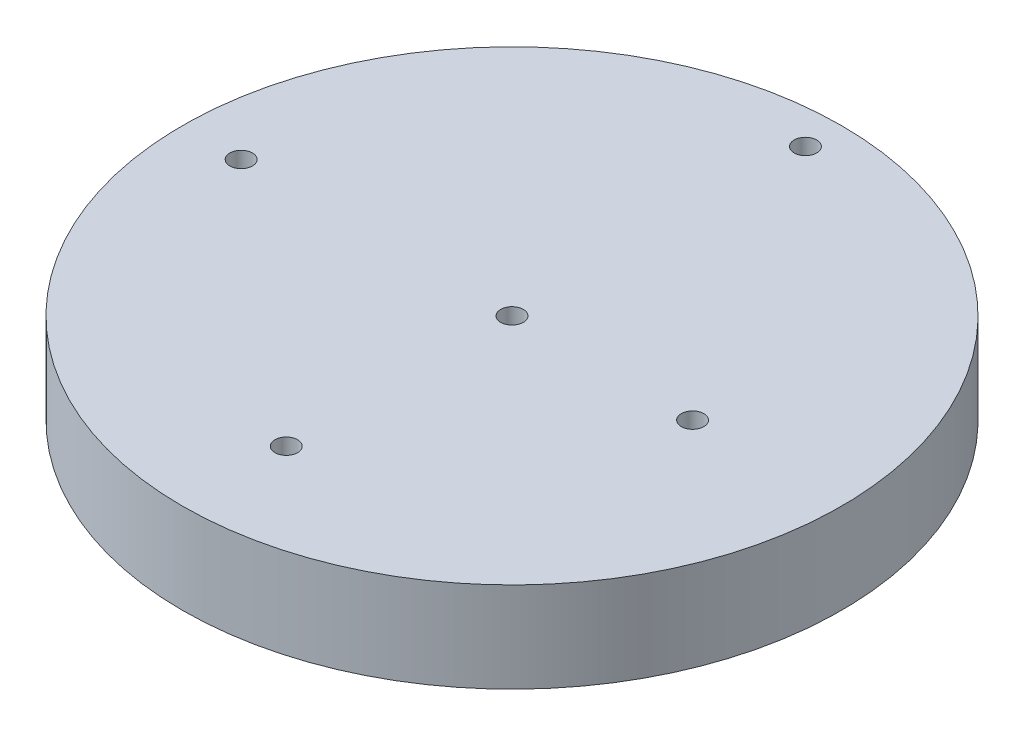
ISO-10303-21;
HEADER;
FILE_DESCRIPTION(('STEP AP214'),'2;1');
FILE_NAME('part.step','',(''),(''),'','','');
FILE_SCHEMA(('AUTOMOTIVE_DESIGN { 1 0 10303 214 1 1 1 1 }'));
ENDSEC;
DATA;
#1=APPLICATION_CONTEXT('core data for automotive mechanical design processes');
#2=APPLICATION_PROTOCOL_DEFINITION('international standard','automotive_design',2000,#1);
#3=PRODUCT_CONTEXT('',#1,'mechanical');
#4=PRODUCT('Part','Part','',(#3));
#5=PRODUCT_RELATED_PRODUCT_CATEGORY('part','',(#4));
#6=PRODUCT_DEFINITION_FORMATION('','',#4);
#7=PRODUCT_DEFINITION_CONTEXT('part definition',#1,'design');
#8=PRODUCT_DEFINITION('design','',#6,#7);
#9=PRODUCT_DEFINITION_SHAPE('','',#8);
#10=(LENGTH_UNIT() NAMED_UNIT(*) SI_UNIT(.MILLI.,.METRE.));
#11=(NAMED_UNIT(*) PLANE_ANGLE_UNIT() SI_UNIT($,.RADIAN.));
#12=(NAMED_UNIT(*) SI_UNIT($,.STERADIAN.) SOLID_ANGLE_UNIT());
#13=UNCERTAINTY_MEASURE_WITH_UNIT(LENGTH_MEASURE(1.E-05),#10,'distance_accuracy_value','');
#14=(GEOMETRIC_REPRESENTATION_CONTEXT(3) GLOBAL_UNCERTAINTY_ASSIGNED_CONTEXT((#13)) GLOBAL_UNIT_ASSIGNED_CONTEXT((#10,
#11,#12)) REPRESENTATION_CONTEXT('',''));
#15=CARTESIAN_POINT('',(0.,0.,0.));
#16=DIRECTION('',(0.,0.,1.));
#17=DIRECTION('',(1.,0.,0.));
#18=AXIS2_PLACEMENT_3D('',#15,#16,#17);
#19=CARTESIAN_POINT('',(0.,12.7,0.));
#20=DIRECTION('',(0.,1.,0.));
#21=DIRECTION('',(0.,0.,1.));
#22=AXIS2_PLACEMENT_3D('',#19,#20,#21);
#23=PLANE('',#22);
#24=CARTESIAN_POINT('',(-38.1,12.7,0.));
#25=DIRECTION('',(0.,1.,0.));
#26=DIRECTION('',(0.,0.,1.));
#27=AXIS2_PLACEMENT_3D('',#24,#25,#26);
#28=CIRCLE('',#27,1.5875);
#29=CARTESIAN_POINT('',(-38.1,12.7,1.5875));
#30=VERTEX_POINT('',#29);
#31=EDGE_CURVE('E59',#30,#30,#28,.T.);
#32=ORIENTED_EDGE('',*,*,#31,.F.);
#33=EDGE_LOOP('',(#32));
#34=FACE_BOUND('',#33,.T.);
#35=CARTESIAN_POINT('',(0.,12.7,-41.275));
#36=DIRECTION('',(0.,1.,0.));
#37=DIRECTION('',(0.,0.,1.));
#38=AXIS2_PLACEMENT_3D('',#35,#36,#37);
#39=CIRCLE('',#38,1.5875);
#40=CARTESIAN_POINT('',(0.,12.7,-39.6875));
#41=VERTEX_POINT('',#40);
#42=EDGE_CURVE('E47',#41,#41,#39,.T.);
#43=ORIENTED_EDGE('',*,*,#42,.F.);
#44=EDGE_LOOP('',(#43));
#45=FACE_BOUND('',#44,.T.);
#46=CARTESIAN_POINT('',(0.,12.7,0.));
#47=DIRECTION('',(0.,1.,0.));
#48=DIRECTION('',(0.,0.,1.));
#49=AXIS2_PLACEMENT_3D('',#46,#47,#48);
#50=CIRCLE('',#49,46.355);
#51=CARTESIAN_POINT('',(0.,12.7,46.355));
#52=VERTEX_POINT('',#51);
#53=EDGE_CURVE('E10',#52,#52,#50,.T.);
#54=ORIENTED_EDGE('',*,*,#53,.T.);
#55=EDGE_LOOP('',(#54));
#56=FACE_BOUND('',#55,.T.);
#57=CARTESIAN_POINT('',(0.,12.7,0.));
#58=DIRECTION('',(0.,1.,0.));
#59=DIRECTION('',(0.,0.,1.));
#60=AXIS2_PLACEMENT_3D('',#57,#58,#59);
#61=CIRCLE('',#60,1.5875);
#62=CARTESIAN_POINT('',(0.,12.7,1.5875));
#63=VERTEX_POINT('',#62);
#64=EDGE_CURVE('E42',#63,#63,#61,.T.);
#65=ORIENTED_EDGE('',*,*,#64,.F.);
#66=EDGE_LOOP('',(#65));
#67=FACE_BOUND('',#66,.T.);
#68=CARTESIAN_POINT('',(25.4,12.7,0.));
#69=DIRECTION('',(0.,1.,0.));
#70=DIRECTION('',(0.,0.,1.));
#71=AXIS2_PLACEMENT_3D('',#68,#69,#70);
#72=CIRCLE('',#71,1.5875);
#73=CARTESIAN_POINT('',(25.4,12.7,1.5875));
#74=VERTEX_POINT('',#73);
#75=EDGE_CURVE('E53',#74,#74,#72,.T.);
#76=ORIENTED_EDGE('',*,*,#75,.F.);
#77=EDGE_LOOP('',(#76));
#78=FACE_BOUND('',#77,.T.);
#79=CARTESIAN_POINT('',(0.,12.7,31.75));
#80=DIRECTION('',(0.,1.,0.));
#81=DIRECTION('',(0.,0.,1.));
#82=AXIS2_PLACEMENT_3D('',#79,#80,#81);
#83=CIRCLE('',#82,1.5875);
#84=CARTESIAN_POINT('',(0.,12.7,33.3375));
#85=VERTEX_POINT('',#84);
#86=EDGE_CURVE('E65',#85,#85,#83,.T.);
#87=ORIENTED_EDGE('',*,*,#86,.F.);
#88=EDGE_LOOP('',(#87));
#89=FACE_BOUND('',#88,.T.);
#90=ADVANCED_FACE('F31',(#34,#45,#56,#67,#78,#89),#23,.T.);
#91=CARTESIAN_POINT('',(0.,0.,0.));
#92=DIRECTION('',(0.,1.,0.));
#93=DIRECTION('',(0.,0.,1.));
#94=AXIS2_PLACEMENT_3D('',#91,#92,#93);
#95=PLANE('',#94);
#96=CARTESIAN_POINT('',(0.,0.,0.));
#97=DIRECTION('',(0.,1.,0.));
#98=DIRECTION('',(0.,0.,1.));
#99=AXIS2_PLACEMENT_3D('',#96,#97,#98);
#100=CIRCLE('',#99,46.355);
#101=CARTESIAN_POINT('',(0.,0.,46.355));
#102=VERTEX_POINT('',#101);
#103=EDGE_CURVE('E35',#102,#102,#100,.T.);
#104=ORIENTED_EDGE('',*,*,#103,.F.);
#105=EDGE_LOOP('',(#104));
#106=FACE_BOUND('',#105,.T.);
#107=CARTESIAN_POINT('',(0.,0.,0.));
#108=DIRECTION('',(0.,1.,0.));
#109=DIRECTION('',(0.,0.,1.));
#110=AXIS2_PLACEMENT_3D('',#107,#108,#109);
#111=CIRCLE('',#110,1.5875);
#112=CARTESIAN_POINT('',(0.,0.,1.5875));
#113=VERTEX_POINT('',#112);
#114=EDGE_CURVE('E44',#113,#113,#111,.T.);
#115=ORIENTED_EDGE('',*,*,#114,.T.);
#116=EDGE_LOOP('',(#115));
#117=FACE_BOUND('',#116,.T.);
#118=CARTESIAN_POINT('',(0.,0.,-41.275));
#119=DIRECTION('',(0.,1.,0.));
#120=DIRECTION('',(0.,0.,1.));
#121=AXIS2_PLACEMENT_3D('',#118,#119,#120);
#122=CIRCLE('',#121,1.5875);
#123=CARTESIAN_POINT('',(0.,0.,-39.6875));
#124=VERTEX_POINT('',#123);
#125=EDGE_CURVE('E50',#124,#124,#122,.T.);
#126=ORIENTED_EDGE('',*,*,#125,.T.);
#127=EDGE_LOOP('',(#126));
#128=FACE_BOUND('',#127,.T.);
#129=CARTESIAN_POINT('',(25.4,0.,0.));
#130=DIRECTION('',(0.,1.,0.));
#131=DIRECTION('',(0.,0.,1.));
#132=AXIS2_PLACEMENT_3D('',#129,#130,#131);
#133=CIRCLE('',#132,1.5875);
#134=CARTESIAN_POINT('',(25.4,0.,1.5875));
#135=VERTEX_POINT('',#134);
#136=EDGE_CURVE('E56',#135,#135,#133,.T.);
#137=ORIENTED_EDGE('',*,*,#136,.T.);
#138=EDGE_LOOP('',(#137));
#139=FACE_BOUND('',#138,.T.);
#140=CARTESIAN_POINT('',(-38.1,0.,0.));
#141=DIRECTION('',(0.,1.,0.));
#142=DIRECTION('',(0.,0.,1.));
#143=AXIS2_PLACEMENT_3D('',#140,#141,#142);
#144=CIRCLE('',#143,1.5875);
#145=CARTESIAN_POINT('',(-38.1,0.,1.5875));
#146=VERTEX_POINT('',#145);
#147=EDGE_CURVE('E62',#146,#146,#144,.T.);
#148=ORIENTED_EDGE('',*,*,#147,.T.);
#149=EDGE_LOOP('',(#148));
#150=FACE_BOUND('',#149,.T.);
#151=CARTESIAN_POINT('',(0.,0.,31.75));
#152=DIRECTION('',(0.,1.,0.));
#153=DIRECTION('',(0.,0.,1.));
#154=AXIS2_PLACEMENT_3D('',#151,#152,#153);
#155=CIRCLE('',#154,1.5875);
#156=CARTESIAN_POINT('',(0.,0.,33.3375));
#157=VERTEX_POINT('',#156);
#158=EDGE_CURVE('E68',#157,#157,#155,.T.);
#159=ORIENTED_EDGE('',*,*,#158,.T.);
#160=EDGE_LOOP('',(#159));
#161=FACE_BOUND('',#160,.T.);
#162=ADVANCED_FACE('F78',(#106,#117,#128,#139,#150,#161),#95,.F.);
#163=CARTESIAN_POINT('',(0.,12.7,0.));
#164=DIRECTION('',(0.,-1.,0.));
#165=DIRECTION('',(0.,0.,-1.));
#166=AXIS2_PLACEMENT_3D('',#163,#164,#165);
#167=CYLINDRICAL_SURFACE('',#166,46.355);
#168=ORIENTED_EDGE('',*,*,#53,.F.);
#169=EDGE_LOOP('',(#168));
#170=FACE_BOUND('',#169,.T.);
#171=ORIENTED_EDGE('',*,*,#103,.T.);
#172=EDGE_LOOP('',(#171));
#173=FACE_BOUND('',#172,.T.);
#174=ADVANCED_FACE('F33',(#170,#173),#167,.T.);
#175=CARTESIAN_POINT('',(0.,12.7,0.));
#176=DIRECTION('',(0.,-1.,0.));
#177=DIRECTION('',(0.,0.,-1.));
#178=AXIS2_PLACEMENT_3D('',#175,#176,#177);
#179=CYLINDRICAL_SURFACE('',#178,1.5875);
#180=ORIENTED_EDGE('',*,*,#64,.T.);
#181=EDGE_LOOP('',(#180));
#182=FACE_BOUND('',#181,.T.);
#183=ORIENTED_EDGE('',*,*,#114,.F.);
#184=EDGE_LOOP('',(#183));
#185=FACE_BOUND('',#184,.T.);
#186=ADVANCED_FACE('F88',(#182,#185),#179,.F.);
#187=CARTESIAN_POINT('',(0.,12.7,-41.275));
#188=DIRECTION('',(0.,-1.,0.));
#189=DIRECTION('',(0.,0.,-1.));
#190=AXIS2_PLACEMENT_3D('',#187,#188,#189);
#191=CYLINDRICAL_SURFACE('',#190,1.5875);
#192=ORIENTED_EDGE('',*,*,#42,.T.);
#193=EDGE_LOOP('',(#192));
#194=FACE_BOUND('',#193,.T.);
#195=ORIENTED_EDGE('',*,*,#125,.F.);
#196=EDGE_LOOP('',(#195));
#197=FACE_BOUND('',#196,.T.);
#198=ADVANCED_FACE('F91',(#194,#197),#191,.F.);
#199=CARTESIAN_POINT('',(25.4,12.7,0.));
#200=DIRECTION('',(0.,-1.,0.));
#201=DIRECTION('',(0.,0.,-1.));
#202=AXIS2_PLACEMENT_3D('',#199,#200,#201);
#203=CYLINDRICAL_SURFACE('',#202,1.5875);
#204=ORIENTED_EDGE('',*,*,#75,.T.);
#205=EDGE_LOOP('',(#204));
#206=FACE_BOUND('',#205,.T.);
#207=ORIENTED_EDGE('',*,*,#136,.F.);
#208=EDGE_LOOP('',(#207));
#209=FACE_BOUND('',#208,.T.);
#210=ADVANCED_FACE('F95',(#206,#209),#203,.F.);
#211=CARTESIAN_POINT('',(-38.1,12.7,0.));
#212=DIRECTION('',(0.,-1.,0.));
#213=DIRECTION('',(0.,0.,-1.));
#214=AXIS2_PLACEMENT_3D('',#211,#212,#213);
#215=CYLINDRICAL_SURFACE('',#214,1.5875);
#216=ORIENTED_EDGE('',*,*,#31,.T.);
#217=EDGE_LOOP('',(#216));
#218=FACE_BOUND('',#217,.T.);
#219=ORIENTED_EDGE('',*,*,#147,.F.);
#220=EDGE_LOOP('',(#219));
#221=FACE_BOUND('',#220,.T.);
#222=ADVANCED_FACE('F99',(#218,#221),#215,.F.);
#223=CARTESIAN_POINT('',(0.,12.7,31.75));
#224=DIRECTION('',(0.,-1.,0.));
#225=DIRECTION('',(0.,0.,-1.));
#226=AXIS2_PLACEMENT_3D('',#223,#224,#225);
#227=CYLINDRICAL_SURFACE('',#226,1.5875);
#228=ORIENTED_EDGE('',*,*,#86,.T.);
#229=EDGE_LOOP('',(#228));
#230=FACE_BOUND('',#229,.T.);
#231=ORIENTED_EDGE('',*,*,#158,.F.);
#232=EDGE_LOOP('',(#231));
#233=FACE_BOUND('',#232,.T.);
#234=ADVANCED_FACE('F74',(#230,#233),#227,.F.);
#235=CLOSED_SHELL('',(#90,#162,#174,#186,#198,#210,#222,#234));
#236=MANIFOLD_SOLID_BREP('B2',#235);
#237=ADVANCED_BREP_SHAPE_REPRESENTATION('',(#18,#236),#14);
#238=SHAPE_DEFINITION_REPRESENTATION(#9,#237);
ENDSEC;
END-ISO-10303-21;
